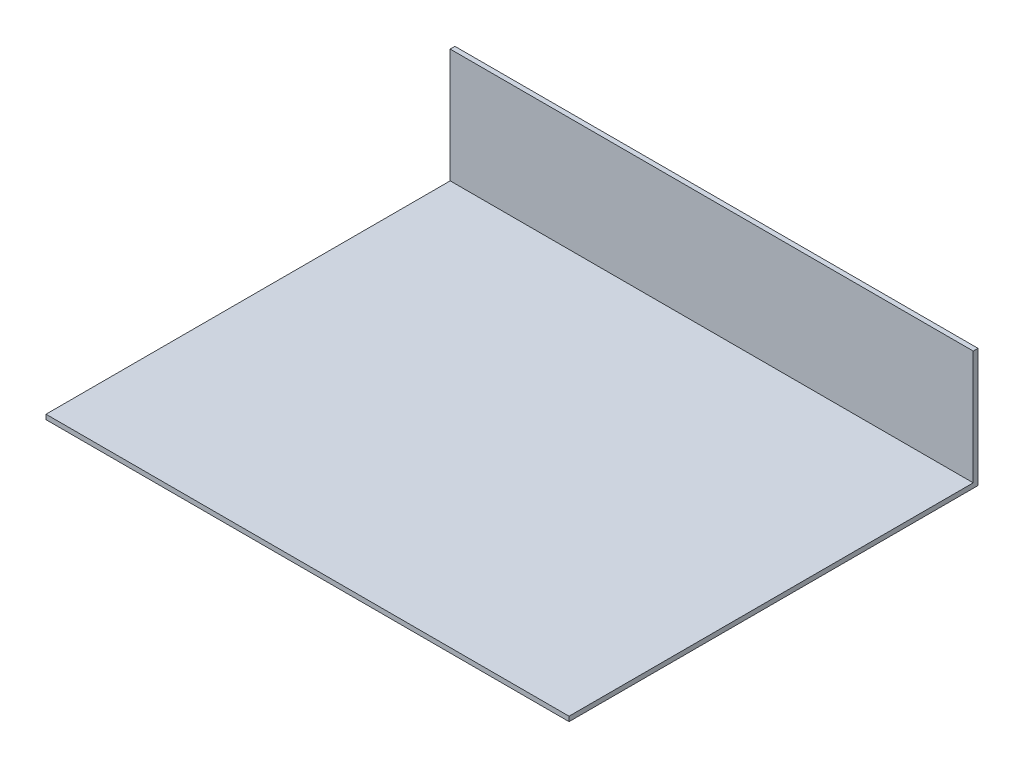
ISO-10303-21;
HEADER;
FILE_DESCRIPTION(('STEP AP214'),'2;1');
FILE_NAME('part.step','',(''),(''),'','','');
FILE_SCHEMA(('AUTOMOTIVE_DESIGN { 1 0 10303 214 1 1 1 1 }'));
ENDSEC;
DATA;
#1=APPLICATION_CONTEXT('core data for automotive mechanical design processes');
#2=APPLICATION_PROTOCOL_DEFINITION('international standard','automotive_design',2000,#1);
#3=PRODUCT_CONTEXT('',#1,'mechanical');
#4=PRODUCT('Part','Part','',(#3));
#5=PRODUCT_RELATED_PRODUCT_CATEGORY('part','',(#4));
#6=PRODUCT_DEFINITION_FORMATION('','',#4);
#7=PRODUCT_DEFINITION_CONTEXT('part definition',#1,'design');
#8=PRODUCT_DEFINITION('design','',#6,#7);
#9=PRODUCT_DEFINITION_SHAPE('','',#8);
#10=(LENGTH_UNIT() NAMED_UNIT(*) SI_UNIT(.MILLI.,.METRE.));
#11=(NAMED_UNIT(*) PLANE_ANGLE_UNIT() SI_UNIT($,.RADIAN.));
#12=(NAMED_UNIT(*) SI_UNIT($,.STERADIAN.) SOLID_ANGLE_UNIT());
#13=UNCERTAINTY_MEASURE_WITH_UNIT(LENGTH_MEASURE(1.E-05),#10,'distance_accuracy_value','');
#14=(GEOMETRIC_REPRESENTATION_CONTEXT(3) GLOBAL_UNCERTAINTY_ASSIGNED_CONTEXT((#13)) GLOBAL_UNIT_ASSIGNED_CONTEXT((#10,
#11,#12)) REPRESENTATION_CONTEXT('',''));
#15=CARTESIAN_POINT('',(0.,0.,0.));
#16=DIRECTION('',(0.,0.,1.));
#17=DIRECTION('',(1.,0.,0.));
#18=AXIS2_PLACEMENT_3D('',#15,#16,#17);
#19=CARTESIAN_POINT('',(0.,0.,2.));
#20=DIRECTION('',(0.,0.,-1.));
#21=DIRECTION('',(-1.,0.,0.));
#22=AXIS2_PLACEMENT_3D('',#19,#20,#21);
#23=PLANE('',#22);
#24=DIRECTION('',(-1.,0.,0.));
#25=VECTOR('',#24,1.);
#26=CARTESIAN_POINT('',(-110.,-23.,2.));
#27=LINE('',#26,#25);
#28=CARTESIAN_POINT('',(110.,-23.,2.));
#29=VERTEX_POINT('',#28);
#30=CARTESIAN_POINT('',(-110.,-23.,2.));
#31=VERTEX_POINT('',#30);
#32=EDGE_CURVE('E34',#29,#31,#27,.T.);
#33=ORIENTED_EDGE('',*,*,#32,.F.);
#34=DIRECTION('',(0.,1.,0.));
#35=VECTOR('',#34,1.);
#36=CARTESIAN_POINT('',(110.,-25.,2.));
#37=LINE('',#36,#35);
#38=CARTESIAN_POINT('',(110.,25.,2.));
#39=VERTEX_POINT('',#38);
#40=EDGE_CURVE('E72',#29,#39,#37,.T.);
#41=ORIENTED_EDGE('',*,*,#40,.T.);
#42=DIRECTION('',(-1.,0.,0.));
#43=VECTOR('',#42,1.);
#44=CARTESIAN_POINT('',(-110.,25.,2.));
#45=LINE('',#44,#43);
#46=CARTESIAN_POINT('',(-110.,25.,2.));
#47=VERTEX_POINT('',#46);
#48=EDGE_CURVE('E40',#39,#47,#45,.T.);
#49=ORIENTED_EDGE('',*,*,#48,.T.);
#50=DIRECTION('',(0.,-1.,0.));
#51=VECTOR('',#50,1.);
#52=CARTESIAN_POINT('',(-110.,-25.,2.));
#53=LINE('',#52,#51);
#54=EDGE_CURVE('E83',#47,#31,#53,.T.);
#55=ORIENTED_EDGE('',*,*,#54,.T.);
#56=EDGE_LOOP('',(#33,#41,#49,#55));
#57=FACE_BOUND('',#56,.T.);
#58=ADVANCED_FACE('F17',(#57),#23,.F.);
#59=CARTESIAN_POINT('',(110.,-25.,2.));
#60=DIRECTION('',(-1.,0.,0.));
#61=DIRECTION('',(0.,0.,1.));
#62=AXIS2_PLACEMENT_3D('',#59,#60,#61);
#63=PLANE('',#62);
#64=DIRECTION('',(0.,1.,0.));
#65=VECTOR('',#64,1.);
#66=CARTESIAN_POINT('',(110.,-25.,0.));
#67=LINE('',#66,#65);
#68=CARTESIAN_POINT('',(110.,-25.,0.));
#69=VERTEX_POINT('',#68);
#70=CARTESIAN_POINT('',(110.,25.,0.));
#71=VERTEX_POINT('',#70);
#72=EDGE_CURVE('E79',#69,#71,#67,.T.);
#73=ORIENTED_EDGE('',*,*,#72,.T.);
#74=DIRECTION('',(0.,0.,-1.));
#75=VECTOR('',#74,1.);
#76=CARTESIAN_POINT('',(110.,25.,2.));
#77=LINE('',#76,#75);
#78=EDGE_CURVE('E11',#39,#71,#77,.T.);
#79=ORIENTED_EDGE('',*,*,#78,.F.);
#80=ORIENTED_EDGE('',*,*,#40,.F.);
#81=DIRECTION('',(0.,0.,-1.));
#82=VECTOR('',#81,1.);
#83=CARTESIAN_POINT('',(110.,-23.,172.));
#84=LINE('',#83,#82);
#85=CARTESIAN_POINT('',(110.,-23.,172.));
#86=VERTEX_POINT('',#85);
#87=EDGE_CURVE('E87',#86,#29,#84,.T.);
#88=ORIENTED_EDGE('',*,*,#87,.F.);
#89=DIRECTION('',(0.,1.,0.));
#90=VECTOR('',#89,1.);
#91=CARTESIAN_POINT('',(110.,-25.,172.));
#92=LINE('',#91,#90);
#93=CARTESIAN_POINT('',(110.,-25.,172.));
#94=VERTEX_POINT('',#93);
#95=EDGE_CURVE('E82',#94,#86,#92,.T.);
#96=ORIENTED_EDGE('',*,*,#95,.F.);
#97=DIRECTION('',(0.,0.,-1.));
#98=VECTOR('',#97,1.);
#99=CARTESIAN_POINT('',(110.,-25.,2.));
#100=LINE('',#99,#98);
#101=EDGE_CURVE('E65',#94,#69,#100,.T.);
#102=ORIENTED_EDGE('',*,*,#101,.T.);
#103=EDGE_LOOP('',(#73,#79,#80,#88,#96,#102));
#104=FACE_BOUND('',#103,.T.);
#105=ADVANCED_FACE('F19',(#104),#63,.F.);
#106=CARTESIAN_POINT('',(-110.,25.,2.));
#107=DIRECTION('',(0.,-1.,0.));
#108=DIRECTION('',(0.,0.,-1.));
#109=AXIS2_PLACEMENT_3D('',#106,#107,#108);
#110=PLANE('',#109);
#111=DIRECTION('',(-1.,0.,0.));
#112=VECTOR('',#111,1.);
#113=CARTESIAN_POINT('',(-110.,25.,0.));
#114=LINE('',#113,#112);
#115=CARTESIAN_POINT('',(-110.,25.,0.));
#116=VERTEX_POINT('',#115);
#117=EDGE_CURVE('E86',#71,#116,#114,.T.);
#118=ORIENTED_EDGE('',*,*,#117,.T.);
#119=DIRECTION('',(0.,0.,-1.));
#120=VECTOR('',#119,1.);
#121=CARTESIAN_POINT('',(-110.,25.,2.));
#122=LINE('',#121,#120);
#123=EDGE_CURVE('E26',#47,#116,#122,.T.);
#124=ORIENTED_EDGE('',*,*,#123,.F.);
#125=ORIENTED_EDGE('',*,*,#48,.F.);
#126=ORIENTED_EDGE('',*,*,#78,.T.);
#127=EDGE_LOOP('',(#118,#124,#125,#126));
#128=FACE_BOUND('',#127,.T.);
#129=ADVANCED_FACE('F137',(#128),#110,.F.);
#130=CARTESIAN_POINT('',(-110.,-25.,2.));
#131=DIRECTION('',(1.,0.,0.));
#132=DIRECTION('',(0.,0.,-1.));
#133=AXIS2_PLACEMENT_3D('',#130,#131,#132);
#134=PLANE('',#133);
#135=DIRECTION('',(0.,-1.,0.));
#136=VECTOR('',#135,1.);
#137=CARTESIAN_POINT('',(-110.,-25.,0.));
#138=LINE('',#137,#136);
#139=CARTESIAN_POINT('',(-110.,-25.,0.));
#140=VERTEX_POINT('',#139);
#141=EDGE_CURVE('E73',#116,#140,#138,.T.);
#142=ORIENTED_EDGE('',*,*,#141,.T.);
#143=DIRECTION('',(0.,0.,-1.));
#144=VECTOR('',#143,1.);
#145=CARTESIAN_POINT('',(-110.,-25.,2.));
#146=LINE('',#145,#144);
#147=CARTESIAN_POINT('',(-110.,-25.,172.));
#148=VERTEX_POINT('',#147);
#149=EDGE_CURVE('E68',#148,#140,#146,.T.);
#150=ORIENTED_EDGE('',*,*,#149,.F.);
#151=DIRECTION('',(0.,-1.,0.));
#152=VECTOR('',#151,1.);
#153=CARTESIAN_POINT('',(-110.,-25.,172.));
#154=LINE('',#153,#152);
#155=CARTESIAN_POINT('',(-110.,-23.,172.));
#156=VERTEX_POINT('',#155);
#157=EDGE_CURVE('E117',#156,#148,#154,.T.);
#158=ORIENTED_EDGE('',*,*,#157,.F.);
#159=DIRECTION('',(0.,0.,-1.));
#160=VECTOR('',#159,1.);
#161=CARTESIAN_POINT('',(-110.,-23.,172.));
#162=LINE('',#161,#160);
#163=EDGE_CURVE('E91',#156,#31,#162,.T.);
#164=ORIENTED_EDGE('',*,*,#163,.T.);
#165=ORIENTED_EDGE('',*,*,#54,.F.);
#166=ORIENTED_EDGE('',*,*,#123,.T.);
#167=EDGE_LOOP('',(#142,#150,#158,#164,#165,#166));
#168=FACE_BOUND('',#167,.T.);
#169=ADVANCED_FACE('F118',(#168),#134,.F.);
#170=CARTESIAN_POINT('',(-110.,-25.,2.));
#171=DIRECTION('',(0.,1.,0.));
#172=DIRECTION('',(0.,0.,1.));
#173=AXIS2_PLACEMENT_3D('',#170,#171,#172);
#174=PLANE('',#173);
#175=DIRECTION('',(1.,0.,0.));
#176=VECTOR('',#175,1.);
#177=CARTESIAN_POINT('',(-110.,-25.,0.));
#178=LINE('',#177,#176);
#179=EDGE_CURVE('E60',#140,#69,#178,.T.);
#180=ORIENTED_EDGE('',*,*,#179,.T.);
#181=ORIENTED_EDGE('',*,*,#101,.F.);
#182=DIRECTION('',(1.,0.,0.));
#183=VECTOR('',#182,1.);
#184=CARTESIAN_POINT('',(-110.,-25.,172.));
#185=LINE('',#184,#183);
#186=EDGE_CURVE('E126',#148,#94,#185,.T.);
#187=ORIENTED_EDGE('',*,*,#186,.F.);
#188=ORIENTED_EDGE('',*,*,#149,.T.);
#189=EDGE_LOOP('',(#180,#181,#187,#188));
#190=FACE_BOUND('',#189,.T.);
#191=ADVANCED_FACE('F62',(#190),#174,.F.);
#192=CARTESIAN_POINT('',(0.,0.,0.));
#193=DIRECTION('',(0.,0.,-1.));
#194=DIRECTION('',(-1.,0.,0.));
#195=AXIS2_PLACEMENT_3D('',#192,#193,#194);
#196=PLANE('',#195);
#197=ORIENTED_EDGE('',*,*,#72,.F.);
#198=ORIENTED_EDGE('',*,*,#179,.F.);
#199=ORIENTED_EDGE('',*,*,#141,.F.);
#200=ORIENTED_EDGE('',*,*,#117,.F.);
#201=EDGE_LOOP('',(#197,#198,#199,#200));
#202=FACE_BOUND('',#201,.T.);
#203=ADVANCED_FACE('F85',(#202),#196,.T.);
#204=CARTESIAN_POINT('',(-110.,-23.,172.));
#205=DIRECTION('',(0.,-1.,0.));
#206=DIRECTION('',(0.,0.,-1.));
#207=AXIS2_PLACEMENT_3D('',#204,#205,#206);
#208=PLANE('',#207);
#209=ORIENTED_EDGE('',*,*,#32,.T.);
#210=ORIENTED_EDGE('',*,*,#163,.F.);
#211=DIRECTION('',(-1.,0.,0.));
#212=VECTOR('',#211,1.);
#213=CARTESIAN_POINT('',(-110.,-23.,172.));
#214=LINE('',#213,#212);
#215=EDGE_CURVE('E120',#86,#156,#214,.T.);
#216=ORIENTED_EDGE('',*,*,#215,.F.);
#217=ORIENTED_EDGE('',*,*,#87,.T.);
#218=EDGE_LOOP('',(#209,#210,#216,#217));
#219=FACE_BOUND('',#218,.T.);
#220=ADVANCED_FACE('F114',(#219),#208,.F.);
#221=CARTESIAN_POINT('',(0.,0.,172.));
#222=DIRECTION('',(0.,0.,-1.));
#223=DIRECTION('',(-1.,0.,0.));
#224=AXIS2_PLACEMENT_3D('',#221,#222,#223);
#225=PLANE('',#224);
#226=ORIENTED_EDGE('',*,*,#157,.T.);
#227=ORIENTED_EDGE('',*,*,#186,.T.);
#228=ORIENTED_EDGE('',*,*,#95,.T.);
#229=ORIENTED_EDGE('',*,*,#215,.T.);
#230=EDGE_LOOP('',(#226,#227,#228,#229));
#231=FACE_BOUND('',#230,.T.);
#232=ADVANCED_FACE('F130',(#231),#225,.F.);
#233=CLOSED_SHELL('',(#58,#105,#129,#169,#191,#203,#220,#232));
#234=MANIFOLD_SOLID_BREP('B1',#233);
#235=ADVANCED_BREP_SHAPE_REPRESENTATION('',(#18,#234),#14);
#236=SHAPE_DEFINITION_REPRESENTATION(#9,#235);
ENDSEC;
END-ISO-10303-21;
